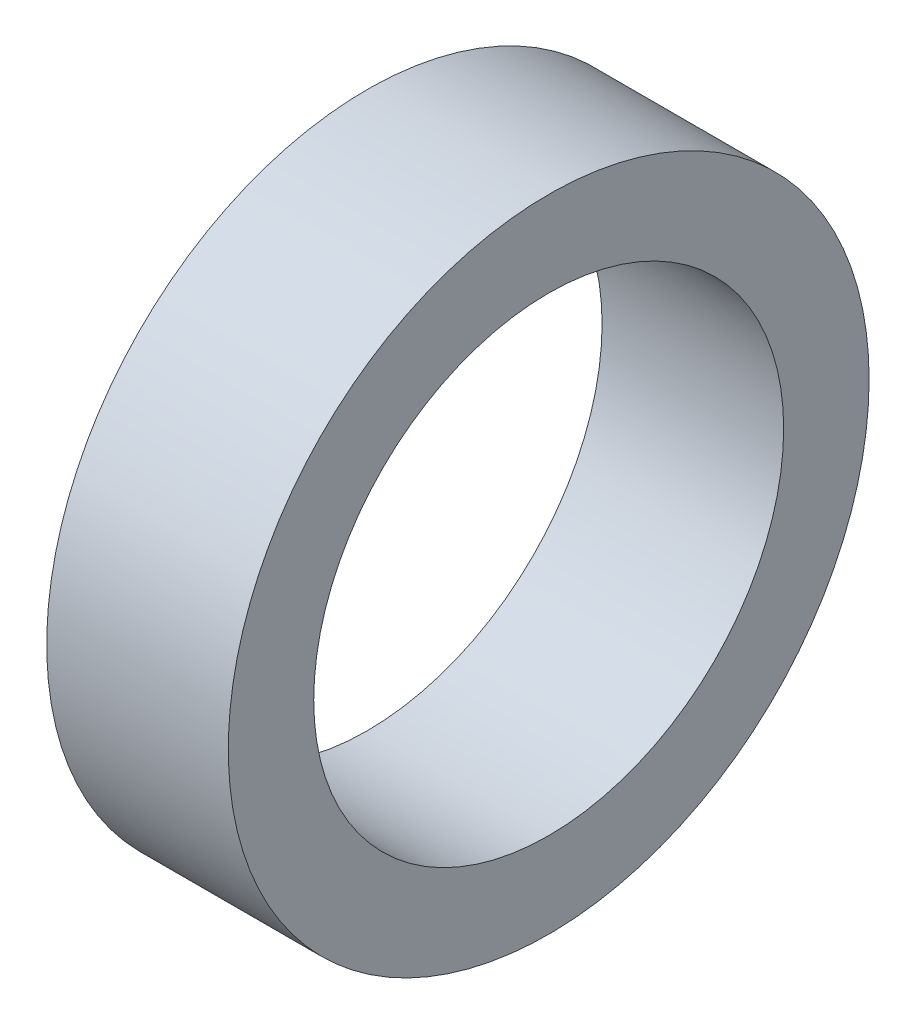
ISO-10303-21;
HEADER;
FILE_DESCRIPTION(('STEP AP214'),'2;1');
FILE_NAME('part.step','',(''),(''),'','','');
FILE_SCHEMA(('AUTOMOTIVE_DESIGN { 1 0 10303 214 1 1 1 1 }'));
ENDSEC;
DATA;
#1=APPLICATION_CONTEXT('core data for automotive mechanical design processes');
#2=APPLICATION_PROTOCOL_DEFINITION('international standard','automotive_design',2000,#1);
#3=PRODUCT_CONTEXT('',#1,'mechanical');
#4=PRODUCT('Part','Part','',(#3));
#5=PRODUCT_RELATED_PRODUCT_CATEGORY('part','',(#4));
#6=PRODUCT_DEFINITION_FORMATION('','',#4);
#7=PRODUCT_DEFINITION_CONTEXT('part definition',#1,'design');
#8=PRODUCT_DEFINITION('design','',#6,#7);
#9=PRODUCT_DEFINITION_SHAPE('','',#8);
#10=(LENGTH_UNIT() NAMED_UNIT(*) SI_UNIT(.MILLI.,.METRE.));
#11=(NAMED_UNIT(*) PLANE_ANGLE_UNIT() SI_UNIT($,.RADIAN.));
#12=(NAMED_UNIT(*) SI_UNIT($,.STERADIAN.) SOLID_ANGLE_UNIT());
#13=UNCERTAINTY_MEASURE_WITH_UNIT(LENGTH_MEASURE(1.E-05),#10,'distance_accuracy_value','');
#14=(GEOMETRIC_REPRESENTATION_CONTEXT(3) GLOBAL_UNCERTAINTY_ASSIGNED_CONTEXT((#13)) GLOBAL_UNIT_ASSIGNED_CONTEXT((#10,
#11,#12)) REPRESENTATION_CONTEXT('',''));
#15=CARTESIAN_POINT('',(0.,0.,0.));
#16=DIRECTION('',(0.,0.,1.));
#17=DIRECTION('',(1.,0.,0.));
#18=AXIS2_PLACEMENT_3D('',#15,#16,#17);
#19=CARTESIAN_POINT('',(-34.,0.,0.));
#20=DIRECTION('',(1.,0.,0.));
#21=DIRECTION('',(0.,0.,-1.));
#22=AXIS2_PLACEMENT_3D('',#19,#20,#21);
#23=CYLINDRICAL_SURFACE('',#22,60.);
#24=CARTESIAN_POINT('',(-34.,0.,0.));
#25=DIRECTION('',(1.,0.,0.));
#26=DIRECTION('',(0.,0.,-1.));
#27=AXIS2_PLACEMENT_3D('',#24,#25,#26);
#28=CIRCLE('',#27,60.);
#29=CARTESIAN_POINT('',(-34.,0.,-60.));
#30=VERTEX_POINT('',#29);
#31=EDGE_CURVE('E10',#30,#30,#28,.T.);
#32=ORIENTED_EDGE('',*,*,#31,.T.);
#33=EDGE_LOOP('',(#32));
#34=FACE_BOUND('',#33,.T.);
#35=CARTESIAN_POINT('',(0.,0.,0.));
#36=DIRECTION('',(1.,0.,0.));
#37=DIRECTION('',(0.,0.,-1.));
#38=AXIS2_PLACEMENT_3D('',#35,#36,#37);
#39=CIRCLE('',#38,60.);
#40=CARTESIAN_POINT('',(0.,0.,-60.));
#41=VERTEX_POINT('',#40);
#42=EDGE_CURVE('E45',#41,#41,#39,.T.);
#43=ORIENTED_EDGE('',*,*,#42,.F.);
#44=EDGE_LOOP('',(#43));
#45=FACE_BOUND('',#44,.T.);
#46=ADVANCED_FACE('F31',(#34,#45),#23,.T.);
#47=CARTESIAN_POINT('',(-34.,60.,0.));
#48=DIRECTION('',(-1.,0.,0.));
#49=DIRECTION('',(0.,0.,1.));
#50=AXIS2_PLACEMENT_3D('',#47,#48,#49);
#51=PLANE('',#50);
#52=CARTESIAN_POINT('',(-34.,0.,0.));
#53=DIRECTION('',(1.,0.,0.));
#54=DIRECTION('',(0.,0.,-1.));
#55=AXIS2_PLACEMENT_3D('',#52,#53,#54);
#56=CIRCLE('',#55,44.);
#57=CARTESIAN_POINT('',(-34.,0.,-44.));
#58=VERTEX_POINT('',#57);
#59=EDGE_CURVE('E37',#58,#58,#56,.T.);
#60=ORIENTED_EDGE('',*,*,#59,.T.);
#61=EDGE_LOOP('',(#60));
#62=FACE_BOUND('',#61,.T.);
#63=ORIENTED_EDGE('',*,*,#31,.F.);
#64=EDGE_LOOP('',(#63));
#65=FACE_BOUND('',#64,.T.);
#66=ADVANCED_FACE('F55',(#62,#65),#51,.T.);
#67=CARTESIAN_POINT('',(-34.,0.,0.));
#68=DIRECTION('',(1.,0.,0.));
#69=DIRECTION('',(0.,0.,-1.));
#70=AXIS2_PLACEMENT_3D('',#67,#68,#69);
#71=CYLINDRICAL_SURFACE('',#70,44.);
#72=CARTESIAN_POINT('',(0.,0.,0.));
#73=DIRECTION('',(1.,0.,0.));
#74=DIRECTION('',(0.,0.,-1.));
#75=AXIS2_PLACEMENT_3D('',#72,#73,#74);
#76=CIRCLE('',#75,44.);
#77=CARTESIAN_POINT('',(0.,0.,-44.));
#78=VERTEX_POINT('',#77);
#79=EDGE_CURVE('E41',#78,#78,#76,.T.);
#80=ORIENTED_EDGE('',*,*,#79,.T.);
#81=EDGE_LOOP('',(#80));
#82=FACE_BOUND('',#81,.T.);
#83=ORIENTED_EDGE('',*,*,#59,.F.);
#84=EDGE_LOOP('',(#83));
#85=FACE_BOUND('',#84,.T.);
#86=ADVANCED_FACE('F59',(#82,#85),#71,.F.);
#87=CARTESIAN_POINT('',(0.,44.,0.));
#88=DIRECTION('',(1.,0.,0.));
#89=DIRECTION('',(0.,0.,-1.));
#90=AXIS2_PLACEMENT_3D('',#87,#88,#89);
#91=PLANE('',#90);
#92=ORIENTED_EDGE('',*,*,#42,.T.);
#93=EDGE_LOOP('',(#92));
#94=FACE_BOUND('',#93,.T.);
#95=ORIENTED_EDGE('',*,*,#79,.F.);
#96=EDGE_LOOP('',(#95));
#97=FACE_BOUND('',#96,.T.);
#98=ADVANCED_FACE('F51',(#94,#97),#91,.T.);
#99=CLOSED_SHELL('',(#46,#66,#86,#98));
#100=MANIFOLD_SOLID_BREP('B2',#99);
#101=ADVANCED_BREP_SHAPE_REPRESENTATION('',(#18,#100),#14);
#102=SHAPE_DEFINITION_REPRESENTATION(#9,#101);
ENDSEC;
END-ISO-10303-21;
